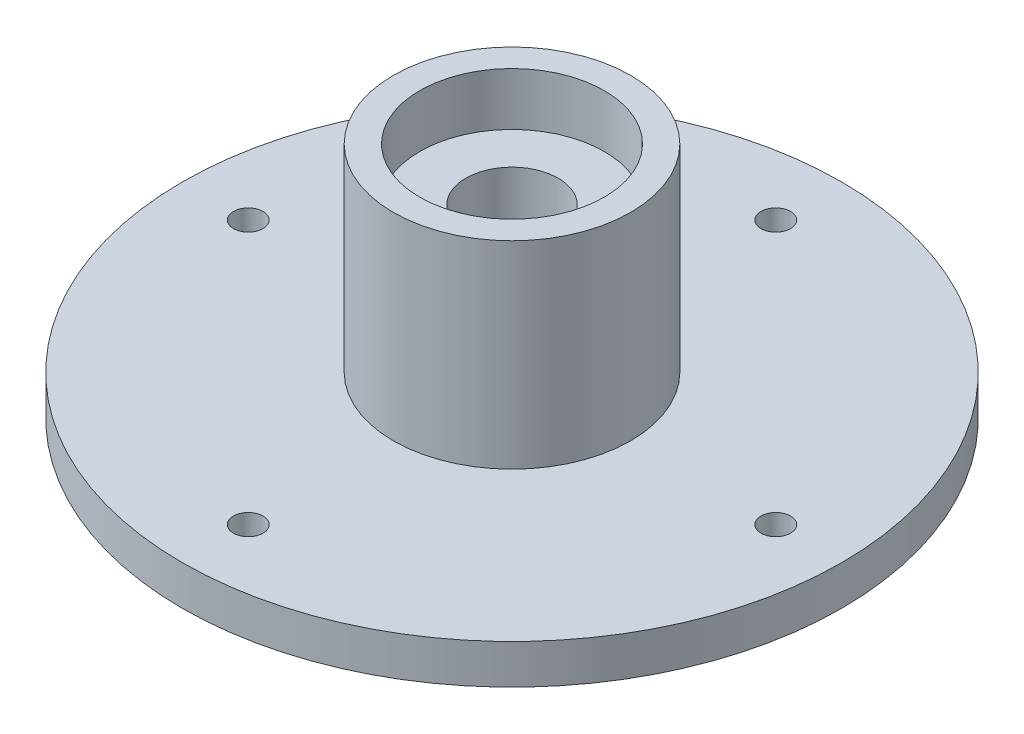
ISO-10303-21;
HEADER;
FILE_DESCRIPTION(('STEP AP214'),'2;1');
FILE_NAME('part.step','',(''),(''),'','','');
FILE_SCHEMA(('AUTOMOTIVE_DESIGN { 1 0 10303 214 1 1 1 1 }'));
ENDSEC;
DATA;
#1=APPLICATION_CONTEXT('core data for automotive mechanical design processes');
#2=APPLICATION_PROTOCOL_DEFINITION('international standard','automotive_design',2000,#1);
#3=PRODUCT_CONTEXT('',#1,'mechanical');
#4=PRODUCT('Part','Part','',(#3));
#5=PRODUCT_RELATED_PRODUCT_CATEGORY('part','',(#4));
#6=PRODUCT_DEFINITION_FORMATION('','',#4);
#7=PRODUCT_DEFINITION_CONTEXT('part definition',#1,'design');
#8=PRODUCT_DEFINITION('design','',#6,#7);
#9=PRODUCT_DEFINITION_SHAPE('','',#8);
#10=(LENGTH_UNIT() NAMED_UNIT(*) SI_UNIT(.MILLI.,.METRE.));
#11=(NAMED_UNIT(*) PLANE_ANGLE_UNIT() SI_UNIT($,.RADIAN.));
#12=(NAMED_UNIT(*) SI_UNIT($,.STERADIAN.) SOLID_ANGLE_UNIT());
#13=UNCERTAINTY_MEASURE_WITH_UNIT(LENGTH_MEASURE(1.E-05),#10,'distance_accuracy_value','');
#14=(GEOMETRIC_REPRESENTATION_CONTEXT(3) GLOBAL_UNCERTAINTY_ASSIGNED_CONTEXT((#13)) GLOBAL_UNIT_ASSIGNED_CONTEXT((#10,
#11,#12)) REPRESENTATION_CONTEXT('',''));
#15=CARTESIAN_POINT('',(0.,0.,0.));
#16=DIRECTION('',(0.,0.,1.));
#17=DIRECTION('',(1.,0.,0.));
#18=AXIS2_PLACEMENT_3D('',#15,#16,#17);
#19=CARTESIAN_POINT('',(0.,0.,0.));
#20=DIRECTION('',(0.,1.,0.));
#21=DIRECTION('',(0.,0.,1.));
#22=AXIS2_PLACEMENT_3D('',#19,#20,#21);
#23=CYLINDRICAL_SURFACE('',#22,7.);
#24=CARTESIAN_POINT('',(0.,28.,0.));
#25=DIRECTION('',(0.,1.,0.));
#26=DIRECTION('',(0.,0.,1.));
#27=AXIS2_PLACEMENT_3D('',#24,#25,#26);
#28=CIRCLE('',#27,7.);
#29=CARTESIAN_POINT('',(0.,28.,7.));
#30=VERTEX_POINT('',#29);
#31=EDGE_CURVE('E56',#30,#30,#28,.F.);
#32=ORIENTED_EDGE('',*,*,#31,.F.);
#33=EDGE_LOOP('',(#32));
#34=FACE_BOUND('',#33,.T.);
#35=CARTESIAN_POINT('',(0.,8.,0.));
#36=DIRECTION('',(0.,-1.,0.));
#37=DIRECTION('',(0.,0.,-1.));
#38=AXIS2_PLACEMENT_3D('',#35,#36,#37);
#39=CIRCLE('',#38,7.);
#40=CARTESIAN_POINT('',(0.,8.,-7.));
#41=VERTEX_POINT('',#40);
#42=EDGE_CURVE('E43',#41,#41,#39,.F.);
#43=ORIENTED_EDGE('',*,*,#42,.F.);
#44=EDGE_LOOP('',(#43));
#45=FACE_BOUND('',#44,.T.);
#46=ADVANCED_FACE('F39',(#34,#45),#23,.F.);
#47=CARTESIAN_POINT('',(0.,6.,0.));
#48=DIRECTION('',(0.,-1.,0.));
#49=DIRECTION('',(0.,0.,-1.));
#50=AXIS2_PLACEMENT_3D('',#47,#48,#49);
#51=CYLINDRICAL_SURFACE('',#50,50.);
#52=CARTESIAN_POINT('',(0.,6.,0.));
#53=DIRECTION('',(0.,1.,0.));
#54=DIRECTION('',(0.,0.,1.));
#55=AXIS2_PLACEMENT_3D('',#52,#53,#54);
#56=CIRCLE('',#55,50.);
#57=CARTESIAN_POINT('',(0.,6.,50.));
#58=VERTEX_POINT('',#57);
#59=EDGE_CURVE('E50',#58,#58,#56,.T.);
#60=ORIENTED_EDGE('',*,*,#59,.F.);
#61=EDGE_LOOP('',(#60));
#62=FACE_BOUND('',#61,.T.);
#63=CARTESIAN_POINT('',(0.,0.,0.));
#64=DIRECTION('',(0.,1.,0.));
#65=DIRECTION('',(0.,0.,1.));
#66=AXIS2_PLACEMENT_3D('',#63,#64,#65);
#67=CIRCLE('',#66,50.);
#68=CARTESIAN_POINT('',(0.,0.,50.));
#69=VERTEX_POINT('',#68);
#70=EDGE_CURVE('E55',#69,#69,#67,.T.);
#71=ORIENTED_EDGE('',*,*,#70,.T.);
#72=EDGE_LOOP('',(#71));
#73=FACE_BOUND('',#72,.T.);
#74=ADVANCED_FACE('F41',(#62,#73),#51,.T.);
#75=CARTESIAN_POINT('',(0.,6.,0.));
#76=DIRECTION('',(0.,1.,0.));
#77=DIRECTION('',(0.,0.,1.));
#78=AXIS2_PLACEMENT_3D('',#75,#76,#77);
#79=PLANE('',#78);
#80=CARTESIAN_POINT('',(-1.39659253553725E-13,6.,40.));
#81=DIRECTION('',(0.,1.,0.));
#82=DIRECTION('',(0.,0.,1.));
#83=AXIS2_PLACEMENT_3D('',#80,#81,#82);
#84=CIRCLE('',#83,2.25);
#85=CARTESIAN_POINT('',(-1.39659253553725E-13,6.,42.25));
#86=VERTEX_POINT('',#85);
#87=EDGE_CURVE('E81',#86,#86,#84,.T.);
#88=ORIENTED_EDGE('',*,*,#87,.F.);
#89=EDGE_LOOP('',(#88));
#90=FACE_BOUND('',#89,.T.);
#91=CARTESIAN_POINT('',(-40.,6.,0.));
#92=DIRECTION('',(0.,1.,0.));
#93=DIRECTION('',(0.,0.,1.));
#94=AXIS2_PLACEMENT_3D('',#91,#92,#93);
#95=CIRCLE('',#94,2.25);
#96=CARTESIAN_POINT('',(-40.,6.,2.25));
#97=VERTEX_POINT('',#96);
#98=EDGE_CURVE('E87',#97,#97,#95,.T.);
#99=ORIENTED_EDGE('',*,*,#98,.F.);
#100=EDGE_LOOP('',(#99));
#101=FACE_BOUND('',#100,.T.);
#102=CARTESIAN_POINT('',(4.18977760661176E-13,6.,-40.));
#103=DIRECTION('',(0.,1.,0.));
#104=DIRECTION('',(0.,0.,1.));
#105=AXIS2_PLACEMENT_3D('',#102,#103,#104);
#106=CIRCLE('',#105,2.25);
#107=CARTESIAN_POINT('',(4.18977760661176E-13,6.,-37.75));
#108=VERTEX_POINT('',#107);
#109=EDGE_CURVE('E89',#108,#108,#106,.T.);
#110=ORIENTED_EDGE('',*,*,#109,.F.);
#111=EDGE_LOOP('',(#110));
#112=FACE_BOUND('',#111,.T.);
#113=CARTESIAN_POINT('',(40.,6.,0.));
#114=DIRECTION('',(0.,1.,0.));
#115=DIRECTION('',(0.,0.,1.));
#116=AXIS2_PLACEMENT_3D('',#113,#114,#115);
#117=CIRCLE('',#116,2.25);
#118=CARTESIAN_POINT('',(40.,6.,2.25));
#119=VERTEX_POINT('',#118);
#120=EDGE_CURVE('E76',#119,#119,#117,.T.);
#121=ORIENTED_EDGE('',*,*,#120,.F.);
#122=EDGE_LOOP('',(#121));
#123=FACE_BOUND('',#122,.T.);
#124=CARTESIAN_POINT('',(0.,6.,0.));
#125=DIRECTION('',(0.,1.,0.));
#126=DIRECTION('',(0.,0.,1.));
#127=AXIS2_PLACEMENT_3D('',#124,#125,#126);
#128=CIRCLE('',#127,18.);
#129=CARTESIAN_POINT('',(0.,6.,18.));
#130=VERTEX_POINT('',#129);
#131=EDGE_CURVE('E10',#130,#130,#128,.T.);
#132=ORIENTED_EDGE('',*,*,#131,.F.);
#133=EDGE_LOOP('',(#132));
#134=FACE_BOUND('',#133,.T.);
#135=ORIENTED_EDGE('',*,*,#59,.T.);
#136=EDGE_LOOP('',(#135));
#137=FACE_BOUND('',#136,.T.);
#138=ADVANCED_FACE('F108',(#90,#101,#112,#123,#134,#137),#79,.T.);
#139=CARTESIAN_POINT('',(0.,0.,0.));
#140=DIRECTION('',(0.,1.,0.));
#141=DIRECTION('',(0.,0.,1.));
#142=AXIS2_PLACEMENT_3D('',#139,#140,#141);
#143=PLANE('',#142);
#144=CARTESIAN_POINT('',(-1.39659253553725E-13,0.,40.));
#145=DIRECTION('',(0.,-1.,0.));
#146=DIRECTION('',(1.,0.,0.));
#147=AXIS2_PLACEMENT_3D('',#144,#145,#146);
#148=CIRCLE('',#147,2.25);
#149=CARTESIAN_POINT('',(2.24999999999986,0.,40.));
#150=VERTEX_POINT('',#149);
#151=EDGE_CURVE('E91',#150,#150,#148,.T.);
#152=ORIENTED_EDGE('',*,*,#151,.F.);
#153=EDGE_LOOP('',(#152));
#154=FACE_BOUND('',#153,.T.);
#155=CARTESIAN_POINT('',(-40.,0.,0.));
#156=DIRECTION('',(0.,-1.,0.));
#157=DIRECTION('',(0.,0.,1.));
#158=AXIS2_PLACEMENT_3D('',#155,#156,#157);
#159=CIRCLE('',#158,2.25);
#160=CARTESIAN_POINT('',(-40.,0.,2.25));
#161=VERTEX_POINT('',#160);
#162=EDGE_CURVE('E100',#161,#161,#159,.T.);
#163=ORIENTED_EDGE('',*,*,#162,.F.);
#164=EDGE_LOOP('',(#163));
#165=FACE_BOUND('',#164,.T.);
#166=CARTESIAN_POINT('',(4.18977760661176E-13,0.,-40.));
#167=DIRECTION('',(0.,-1.,0.));
#168=DIRECTION('',(-1.,0.,0.));
#169=AXIS2_PLACEMENT_3D('',#166,#167,#168);
#170=CIRCLE('',#169,2.25);
#171=CARTESIAN_POINT('',(-2.24999999999958,0.,-40.));
#172=VERTEX_POINT('',#171);
#173=EDGE_CURVE('E94',#172,#172,#170,.T.);
#174=ORIENTED_EDGE('',*,*,#173,.F.);
#175=EDGE_LOOP('',(#174));
#176=FACE_BOUND('',#175,.T.);
#177=CARTESIAN_POINT('',(40.,0.,0.));
#178=DIRECTION('',(0.,-1.,0.));
#179=DIRECTION('',(0.,0.,-1.));
#180=AXIS2_PLACEMENT_3D('',#177,#178,#179);
#181=CIRCLE('',#180,2.25);
#182=CARTESIAN_POINT('',(40.,0.,-2.25));
#183=VERTEX_POINT('',#182);
#184=EDGE_CURVE('E82',#183,#183,#181,.T.);
#185=ORIENTED_EDGE('',*,*,#184,.F.);
#186=EDGE_LOOP('',(#185));
#187=FACE_BOUND('',#186,.T.);
#188=CARTESIAN_POINT('',(0.,0.,0.));
#189=DIRECTION('',(0.,-1.,0.));
#190=DIRECTION('',(0.,0.,-1.));
#191=AXIS2_PLACEMENT_3D('',#188,#189,#190);
#192=CIRCLE('',#191,14.);
#193=CARTESIAN_POINT('',(0.,0.,-14.));
#194=VERTEX_POINT('',#193);
#195=EDGE_CURVE('E75',#194,#194,#192,.T.);
#196=ORIENTED_EDGE('',*,*,#195,.F.);
#197=EDGE_LOOP('',(#196));
#198=FACE_BOUND('',#197,.T.);
#199=ORIENTED_EDGE('',*,*,#70,.F.);
#200=EDGE_LOOP('',(#199));
#201=FACE_BOUND('',#200,.T.);
#202=ADVANCED_FACE('F104',(#154,#165,#176,#187,#198,#201),#143,.F.);
#203=CARTESIAN_POINT('',(0.,36.,0.));
#204=DIRECTION('',(0.,-1.,0.));
#205=DIRECTION('',(0.,0.,-1.));
#206=AXIS2_PLACEMENT_3D('',#203,#204,#205);
#207=CYLINDRICAL_SURFACE('',#206,18.);
#208=CARTESIAN_POINT('',(0.,36.,0.));
#209=DIRECTION('',(0.,1.,0.));
#210=DIRECTION('',(0.,0.,1.));
#211=AXIS2_PLACEMENT_3D('',#208,#209,#210);
#212=CIRCLE('',#211,18.);
#213=CARTESIAN_POINT('',(0.,36.,18.));
#214=VERTEX_POINT('',#213);
#215=EDGE_CURVE('E54',#214,#214,#212,.T.);
#216=ORIENTED_EDGE('',*,*,#215,.F.);
#217=EDGE_LOOP('',(#216));
#218=FACE_BOUND('',#217,.T.);
#219=ORIENTED_EDGE('',*,*,#131,.T.);
#220=EDGE_LOOP('',(#219));
#221=FACE_BOUND('',#220,.T.);
#222=ADVANCED_FACE('F107',(#218,#221),#207,.T.);
#223=CARTESIAN_POINT('',(0.,36.,0.));
#224=DIRECTION('',(0.,1.,0.));
#225=DIRECTION('',(0.,0.,1.));
#226=AXIS2_PLACEMENT_3D('',#223,#224,#225);
#227=PLANE('',#226);
#228=CARTESIAN_POINT('',(0.,36.,0.));
#229=DIRECTION('',(0.,1.,0.));
#230=DIRECTION('',(0.,0.,1.));
#231=AXIS2_PLACEMENT_3D('',#228,#229,#230);
#232=CIRCLE('',#231,14.);
#233=CARTESIAN_POINT('',(0.,36.,14.));
#234=VERTEX_POINT('',#233);
#235=EDGE_CURVE('E67',#234,#234,#232,.T.);
#236=ORIENTED_EDGE('',*,*,#235,.F.);
#237=EDGE_LOOP('',(#236));
#238=FACE_BOUND('',#237,.T.);
#239=ORIENTED_EDGE('',*,*,#215,.T.);
#240=EDGE_LOOP('',(#239));
#241=FACE_BOUND('',#240,.T.);
#242=ADVANCED_FACE('F142',(#238,#241),#227,.T.);
#243=CARTESIAN_POINT('',(0.,28.,0.));
#244=DIRECTION('',(0.,1.,0.));
#245=DIRECTION('',(0.,0.,1.));
#246=AXIS2_PLACEMENT_3D('',#243,#244,#245);
#247=PLANE('',#246);
#248=CARTESIAN_POINT('',(0.,28.,0.));
#249=DIRECTION('',(0.,1.,0.));
#250=DIRECTION('',(0.,0.,1.));
#251=AXIS2_PLACEMENT_3D('',#248,#249,#250);
#252=CIRCLE('',#251,14.);
#253=CARTESIAN_POINT('',(0.,28.,14.));
#254=VERTEX_POINT('',#253);
#255=EDGE_CURVE('E61',#254,#254,#252,.T.);
#256=ORIENTED_EDGE('',*,*,#255,.T.);
#257=EDGE_LOOP('',(#256));
#258=FACE_BOUND('',#257,.T.);
#259=ORIENTED_EDGE('',*,*,#31,.T.);
#260=EDGE_LOOP('',(#259));
#261=FACE_BOUND('',#260,.T.);
#262=ADVANCED_FACE('F144',(#258,#261),#247,.T.);
#263=CARTESIAN_POINT('',(0.,28.,0.));
#264=DIRECTION('',(0.,1.,0.));
#265=DIRECTION('',(0.,0.,1.));
#266=AXIS2_PLACEMENT_3D('',#263,#264,#265);
#267=CYLINDRICAL_SURFACE('',#266,14.);
#268=ORIENTED_EDGE('',*,*,#255,.F.);
#269=EDGE_LOOP('',(#268));
#270=FACE_BOUND('',#269,.T.);
#271=ORIENTED_EDGE('',*,*,#235,.T.);
#272=EDGE_LOOP('',(#271));
#273=FACE_BOUND('',#272,.T.);
#274=ADVANCED_FACE('F138',(#270,#273),#267,.F.);
#275=CARTESIAN_POINT('',(0.,8.,0.));
#276=DIRECTION('',(0.,-1.,0.));
#277=DIRECTION('',(0.,0.,-1.));
#278=AXIS2_PLACEMENT_3D('',#275,#276,#277);
#279=PLANE('',#278);
#280=CARTESIAN_POINT('',(0.,8.,0.));
#281=DIRECTION('',(0.,-1.,0.));
#282=DIRECTION('',(0.,0.,-1.));
#283=AXIS2_PLACEMENT_3D('',#280,#281,#282);
#284=CIRCLE('',#283,14.);
#285=CARTESIAN_POINT('',(0.,8.,-14.));
#286=VERTEX_POINT('',#285);
#287=EDGE_CURVE('E73',#286,#286,#284,.T.);
#288=ORIENTED_EDGE('',*,*,#287,.T.);
#289=EDGE_LOOP('',(#288));
#290=FACE_BOUND('',#289,.T.);
#291=ORIENTED_EDGE('',*,*,#42,.T.);
#292=EDGE_LOOP('',(#291));
#293=FACE_BOUND('',#292,.T.);
#294=ADVANCED_FACE('F166',(#290,#293),#279,.T.);
#295=CARTESIAN_POINT('',(0.,8.,0.));
#296=DIRECTION('',(0.,-1.,0.));
#297=DIRECTION('',(0.,0.,-1.));
#298=AXIS2_PLACEMENT_3D('',#295,#296,#297);
#299=CYLINDRICAL_SURFACE('',#298,14.);
#300=ORIENTED_EDGE('',*,*,#287,.F.);
#301=EDGE_LOOP('',(#300));
#302=FACE_BOUND('',#301,.T.);
#303=ORIENTED_EDGE('',*,*,#195,.T.);
#304=EDGE_LOOP('',(#303));
#305=FACE_BOUND('',#304,.T.);
#306=ADVANCED_FACE('F184',(#302,#305),#299,.F.);
#307=CARTESIAN_POINT('',(40.,36.,0.));
#308=DIRECTION('',(0.,-1.,0.));
#309=DIRECTION('',(0.,0.,-1.));
#310=AXIS2_PLACEMENT_3D('',#307,#308,#309);
#311=CYLINDRICAL_SURFACE('',#310,2.25);
#312=ORIENTED_EDGE('',*,*,#120,.T.);
#313=EDGE_LOOP('',(#312));
#314=FACE_BOUND('',#313,.T.);
#315=ORIENTED_EDGE('',*,*,#184,.T.);
#316=EDGE_LOOP('',(#315));
#317=FACE_BOUND('',#316,.T.);
#318=ADVANCED_FACE('F191',(#314,#317),#311,.F.);
#319=CARTESIAN_POINT('',(4.18977760661176E-13,36.,-40.));
#320=DIRECTION('',(0.,-1.,0.));
#321=DIRECTION('',(0.,0.,-1.));
#322=AXIS2_PLACEMENT_3D('',#319,#320,#321);
#323=CYLINDRICAL_SURFACE('',#322,2.25);
#324=ORIENTED_EDGE('',*,*,#109,.T.);
#325=EDGE_LOOP('',(#324));
#326=FACE_BOUND('',#325,.T.);
#327=ORIENTED_EDGE('',*,*,#173,.T.);
#328=EDGE_LOOP('',(#327));
#329=FACE_BOUND('',#328,.T.);
#330=ADVANCED_FACE('F204',(#326,#329),#323,.F.);
#331=CARTESIAN_POINT('',(-40.,36.,0.));
#332=DIRECTION('',(0.,-1.,0.));
#333=DIRECTION('',(0.,0.,-1.));
#334=AXIS2_PLACEMENT_3D('',#331,#332,#333);
#335=CYLINDRICAL_SURFACE('',#334,2.25);
#336=ORIENTED_EDGE('',*,*,#98,.T.);
#337=EDGE_LOOP('',(#336));
#338=FACE_BOUND('',#337,.T.);
#339=ORIENTED_EDGE('',*,*,#162,.T.);
#340=EDGE_LOOP('',(#339));
#341=FACE_BOUND('',#340,.T.);
#342=ADVANCED_FACE('F212',(#338,#341),#335,.F.);
#343=CARTESIAN_POINT('',(-1.39659253553725E-13,36.,40.));
#344=DIRECTION('',(0.,-1.,0.));
#345=DIRECTION('',(0.,0.,-1.));
#346=AXIS2_PLACEMENT_3D('',#343,#344,#345);
#347=CYLINDRICAL_SURFACE('',#346,2.25);
#348=ORIENTED_EDGE('',*,*,#87,.T.);
#349=EDGE_LOOP('',(#348));
#350=FACE_BOUND('',#349,.T.);
#351=ORIENTED_EDGE('',*,*,#151,.T.);
#352=EDGE_LOOP('',(#351));
#353=FACE_BOUND('',#352,.T.);
#354=ADVANCED_FACE('F103',(#350,#353),#347,.F.);
#355=CLOSED_SHELL('',(#46,#74,#138,#202,#222,#242,#262,#274,#294,#306,#318,#330,#342,#354));
#356=MANIFOLD_SOLID_BREP('B2',#355);
#357=ADVANCED_BREP_SHAPE_REPRESENTATION('',(#18,#356),#14);
#358=SHAPE_DEFINITION_REPRESENTATION(#9,#357);
ENDSEC;
END-ISO-10303-21;
